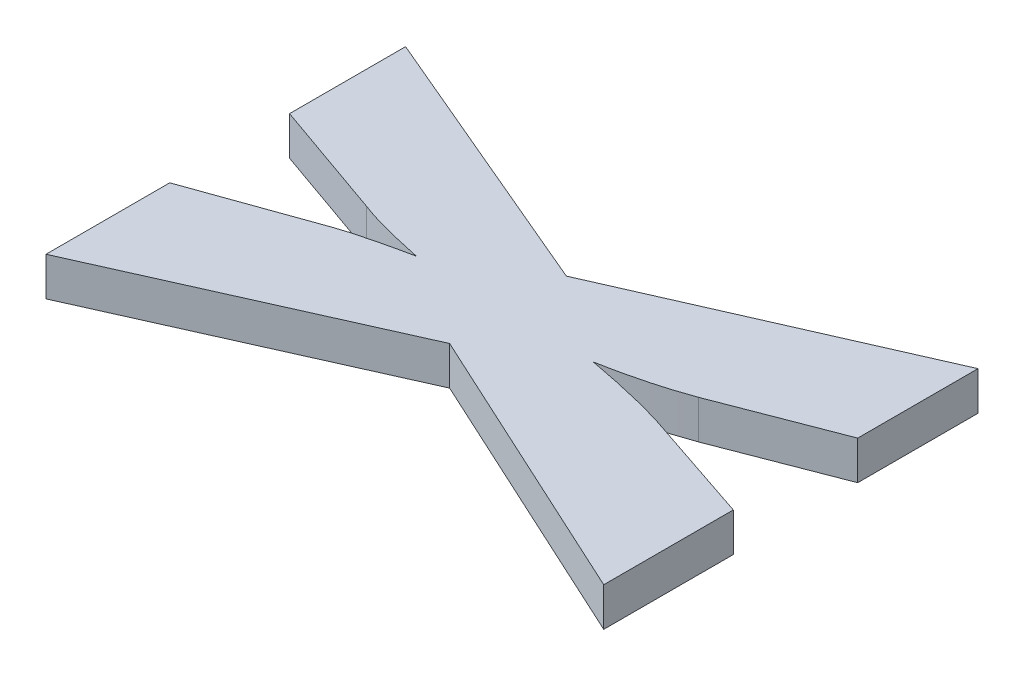
ISO-10303-21;
HEADER;
FILE_DESCRIPTION(('STEP AP214'),'2;1');
FILE_NAME('part.step','',(''),(''),'','','');
FILE_SCHEMA(('AUTOMOTIVE_DESIGN { 1 0 10303 214 1 1 1 1 }'));
ENDSEC;
DATA;
#1=APPLICATION_CONTEXT('core data for automotive mechanical design processes');
#2=APPLICATION_PROTOCOL_DEFINITION('international standard','automotive_design',2000,#1);
#3=PRODUCT_CONTEXT('',#1,'mechanical');
#4=PRODUCT('Part','Part','',(#3));
#5=PRODUCT_RELATED_PRODUCT_CATEGORY('part','',(#4));
#6=PRODUCT_DEFINITION_FORMATION('','',#4);
#7=PRODUCT_DEFINITION_CONTEXT('part definition',#1,'design');
#8=PRODUCT_DEFINITION('design','',#6,#7);
#9=PRODUCT_DEFINITION_SHAPE('','',#8);
#10=(LENGTH_UNIT() NAMED_UNIT(*) SI_UNIT(.MILLI.,.METRE.));
#11=(NAMED_UNIT(*) PLANE_ANGLE_UNIT() SI_UNIT($,.RADIAN.));
#12=(NAMED_UNIT(*) SI_UNIT($,.STERADIAN.) SOLID_ANGLE_UNIT());
#13=UNCERTAINTY_MEASURE_WITH_UNIT(LENGTH_MEASURE(1.E-05),#10,'distance_accuracy_value','');
#14=(GEOMETRIC_REPRESENTATION_CONTEXT(3) GLOBAL_UNCERTAINTY_ASSIGNED_CONTEXT((#13)) GLOBAL_UNIT_ASSIGNED_CONTEXT((#10,
#11,#12)) REPRESENTATION_CONTEXT('',''));
#15=CARTESIAN_POINT('',(0.,0.,0.));
#16=DIRECTION('',(0.,0.,1.));
#17=DIRECTION('',(1.,0.,0.));
#18=AXIS2_PLACEMENT_3D('',#15,#16,#17);
#19=CARTESIAN_POINT('',(2.55,2.9956,3.4607792207792));
#20=DIRECTION('',(1.,0.,0.));
#21=DIRECTION('',(0.,-1.,0.));
#22=AXIS2_PLACEMENT_3D('',#19,#20,#21);
#23=PLANE('',#22);
#24=DIRECTION('',(0.,0.,1.));
#25=VECTOR('',#24,1.);
#26=CARTESIAN_POINT('',(2.55,2.9306,3.4607792207792));
#27=LINE('',#26,#25);
#28=CARTESIAN_POINT('',(2.55,2.9306,3.4607792207792));
#29=VERTEX_POINT('',#28);
#30=CARTESIAN_POINT('',(2.55,2.9306,3.6630012175325));
#31=VERTEX_POINT('',#30);
#32=EDGE_CURVE('E11',#29,#31,#27,.T.);
#33=ORIENTED_EDGE('',*,*,#32,.F.);
#34=DIRECTION('',(0.,-1.,0.));
#35=VECTOR('',#34,1.);
#36=CARTESIAN_POINT('',(2.55,2.9956,3.4607792207792));
#37=LINE('',#36,#35);
#38=CARTESIAN_POINT('',(2.55,2.9956,3.4607792207792));
#39=VERTEX_POINT('',#38);
#40=EDGE_CURVE('E24',#39,#29,#37,.T.);
#41=ORIENTED_EDGE('',*,*,#40,.F.);
#42=DIRECTION('',(0.,0.,1.));
#43=VECTOR('',#42,1.);
#44=CARTESIAN_POINT('',(2.55,2.9956,3.4607792207792));
#45=LINE('',#44,#43);
#46=CARTESIAN_POINT('',(2.55,2.9956,3.6630012175325));
#47=VERTEX_POINT('',#46);
#48=EDGE_CURVE('E309',#39,#47,#45,.T.);
#49=ORIENTED_EDGE('',*,*,#48,.T.);
#50=DIRECTION('',(0.,-1.,0.));
#51=VECTOR('',#50,1.);
#52=CARTESIAN_POINT('',(2.55,2.9956,3.6630012175325));
#53=LINE('',#52,#51);
#54=EDGE_CURVE('E150',#47,#31,#53,.T.);
#55=ORIENTED_EDGE('',*,*,#54,.T.);
#56=EDGE_LOOP('',(#33,#41,#49,#55));
#57=FACE_BOUND('',#56,.T.);
#58=ADVANCED_FACE('F17',(#57),#23,.T.);
#59=CARTESIAN_POINT('',(2.0692167207792,2.9956,3.6720616883117));
#60=DIRECTION('',(-0.402320316865227,0.,-0.91549896921704));
#61=DIRECTION('',(-0.91549896921704,0.,0.402320316865227));
#62=AXIS2_PLACEMENT_3D('',#59,#60,#61);
#63=PLANE('',#62);
#64=DIRECTION('',(0.91549896921704,0.,-0.402320316865228));
#65=VECTOR('',#64,1.);
#66=CARTESIAN_POINT('',(2.0692167207792,2.9306,3.6720616883117));
#67=LINE('',#66,#65);
#68=CARTESIAN_POINT('',(2.0692167207792,2.9306,3.6720616883117));
#69=VERTEX_POINT('',#68);
#70=EDGE_CURVE('E306',#69,#29,#67,.T.);
#71=ORIENTED_EDGE('',*,*,#70,.F.);
#72=DIRECTION('',(0.,-1.,0.));
#73=VECTOR('',#72,1.);
#74=CARTESIAN_POINT('',(2.0692167207792,2.9956,3.6720616883117));
#75=LINE('',#74,#73);
#76=CARTESIAN_POINT('',(2.0692167207792,2.9956,3.6720616883117));
#77=VERTEX_POINT('',#76);
#78=EDGE_CURVE('E303',#77,#69,#75,.T.);
#79=ORIENTED_EDGE('',*,*,#78,.F.);
#80=DIRECTION('',(0.91549896921704,0.,-0.402320316865228));
#81=VECTOR('',#80,1.);
#82=CARTESIAN_POINT('',(2.0692167207792,2.9956,3.6720616883117));
#83=LINE('',#82,#81);
#84=EDGE_CURVE('E300',#77,#39,#83,.T.);
#85=ORIENTED_EDGE('',*,*,#84,.T.);
#86=ORIENTED_EDGE('',*,*,#40,.T.);
#87=EDGE_LOOP('',(#71,#79,#85,#86));
#88=FACE_BOUND('',#87,.T.);
#89=ADVANCED_FACE('F311',(#88),#63,.T.);
#90=CARTESIAN_POINT('',(1.6,2.9956,3.4731168831169));
#91=DIRECTION('',(0.390355561117717,0.,-0.920664181938492));
#92=DIRECTION('',(-0.920664181938492,0.,-0.390355561117717));
#93=AXIS2_PLACEMENT_3D('',#90,#91,#92);
#94=PLANE('',#93);
#95=DIRECTION('',(0.920664181938492,0.,0.390355561117717));
#96=VECTOR('',#95,1.);
#97=CARTESIAN_POINT('',(1.6,2.9306,3.4731168831169));
#98=LINE('',#97,#96);
#99=CARTESIAN_POINT('',(1.6,2.9306,3.4731168831169));
#100=VERTEX_POINT('',#99);
#101=EDGE_CURVE('E297',#100,#69,#98,.T.);
#102=ORIENTED_EDGE('',*,*,#101,.F.);
#103=DIRECTION('',(0.,-1.,0.));
#104=VECTOR('',#103,1.);
#105=CARTESIAN_POINT('',(1.6,2.9956,3.4731168831169));
#106=LINE('',#105,#104);
#107=CARTESIAN_POINT('',(1.6,2.9956,3.4731168831169));
#108=VERTEX_POINT('',#107);
#109=EDGE_CURVE('E294',#108,#100,#106,.T.);
#110=ORIENTED_EDGE('',*,*,#109,.F.);
#111=DIRECTION('',(0.920664181938492,0.,0.390355561117717));
#112=VECTOR('',#111,1.);
#113=CARTESIAN_POINT('',(1.6,2.9956,3.4731168831169));
#114=LINE('',#113,#112);
#115=EDGE_CURVE('E291',#108,#77,#114,.T.);
#116=ORIENTED_EDGE('',*,*,#115,.T.);
#117=ORIENTED_EDGE('',*,*,#78,.T.);
#118=EDGE_LOOP('',(#102,#110,#116,#117));
#119=FACE_BOUND('',#118,.T.);
#120=ADVANCED_FACE('F315',(#119),#94,.T.);
#121=CARTESIAN_POINT('',(1.6,2.9956,3.6682061688312));
#122=DIRECTION('',(-1.,0.,0.));
#123=DIRECTION('',(0.,1.,0.));
#124=AXIS2_PLACEMENT_3D('',#121,#122,#123);
#125=PLANE('',#124);
#126=DIRECTION('',(0.,0.,-1.));
#127=VECTOR('',#126,1.);
#128=CARTESIAN_POINT('',(1.6,2.9306,3.6682061688312));
#129=LINE('',#128,#127);
#130=CARTESIAN_POINT('',(1.6,2.9306,3.6682061688312));
#131=VERTEX_POINT('',#130);
#132=EDGE_CURVE('E288',#131,#100,#129,.T.);
#133=ORIENTED_EDGE('',*,*,#132,.F.);
#134=DIRECTION('',(0.,-1.,0.));
#135=VECTOR('',#134,1.);
#136=CARTESIAN_POINT('',(1.6,2.9956,3.6682061688312));
#137=LINE('',#136,#135);
#138=CARTESIAN_POINT('',(1.6,2.9956,3.6682061688312));
#139=VERTEX_POINT('',#138);
#140=EDGE_CURVE('E285',#139,#131,#137,.T.);
#141=ORIENTED_EDGE('',*,*,#140,.F.);
#142=DIRECTION('',(0.,0.,-1.));
#143=VECTOR('',#142,1.);
#144=CARTESIAN_POINT('',(1.6,2.9956,3.6682061688312));
#145=LINE('',#144,#143);
#146=EDGE_CURVE('E282',#139,#108,#145,.T.);
#147=ORIENTED_EDGE('',*,*,#146,.T.);
#148=ORIENTED_EDGE('',*,*,#109,.T.);
#149=EDGE_LOOP('',(#133,#141,#147,#148));
#150=FACE_BOUND('',#149,.T.);
#151=ADVANCED_FACE('F318',(#150),#125,.T.);
#152=CARTESIAN_POINT('',(1.7991375811688,2.9956,3.7381838474026));
#153=DIRECTION('',(-0.331529937835981,0.,0.943444699131046));
#154=DIRECTION('',(0.943444699131046,0.,0.331529937835981));
#155=AXIS2_PLACEMENT_3D('',#152,#153,#154);
#156=PLANE('',#155);
#157=DIRECTION('',(-0.943444699131046,0.,-0.331529937835981));
#158=VECTOR('',#157,1.);
#159=CARTESIAN_POINT('',(1.7991375811688,2.9306,3.7381838474026));
#160=LINE('',#159,#158);
#161=CARTESIAN_POINT('',(1.7991375811688,2.9306,3.7381838474026));
#162=VERTEX_POINT('',#161);
#163=EDGE_CURVE('E279',#162,#131,#160,.T.);
#164=ORIENTED_EDGE('',*,*,#163,.F.);
#165=DIRECTION('',(0.,-1.,0.));
#166=VECTOR('',#165,1.);
#167=CARTESIAN_POINT('',(1.7991375811688,2.9956,3.7381838474026));
#168=LINE('',#167,#166);
#169=CARTESIAN_POINT('',(1.7991375811688,2.9956,3.7381838474026));
#170=VERTEX_POINT('',#169);
#171=EDGE_CURVE('E276',#170,#162,#168,.T.);
#172=ORIENTED_EDGE('',*,*,#171,.F.);
#173=DIRECTION('',(-0.943444699131046,0.,-0.331529937835981));
#174=VECTOR('',#173,1.);
#175=CARTESIAN_POINT('',(1.7991375811688,2.9956,3.7381838474026));
#176=LINE('',#175,#174);
#177=EDGE_CURVE('E270',#170,#139,#176,.T.);
#178=ORIENTED_EDGE('',*,*,#177,.T.);
#179=ORIENTED_EDGE('',*,*,#140,.T.);
#180=EDGE_LOOP('',(#164,#172,#178,#179));
#181=FACE_BOUND('',#180,.T.);
#182=ADVANCED_FACE('F323',(#181),#156,.T.);
#183=CARTESIAN_POINT('',(1.9142248376623,2.9956,3.7692207792208));
#184=CARTESIAN_POINT('',(1.9142248376623,2.9306,3.7692207792208));
#185=CARTESIAN_POINT('',(1.9025171784066,2.9956,3.7667062151642));
#186=CARTESIAN_POINT('',(1.9025171784066,2.9306,3.7667062151642));
#187=CARTESIAN_POINT('',(1.880325663978,2.9956,3.7619399349605));
#188=CARTESIAN_POINT('',(1.880325663978,2.9306,3.7619399349605));
#189=CARTESIAN_POINT('',(1.849220311507,2.9956,3.7543701297181));
#190=CARTESIAN_POINT('',(1.849220311507,2.9306,3.7543701297181));
#191=CARTESIAN_POINT('',(1.8224970983693,2.9956,3.7466435022342));
#192=CARTESIAN_POINT('',(1.8224970983693,2.9306,3.7466435022342));
#193=CARTESIAN_POINT('',(1.8064384882112,2.9956,3.7408278726624));
#194=CARTESIAN_POINT('',(1.8064384882112,2.9306,3.7408278726624));
#195=CARTESIAN_POINT('',(1.7991375811688,2.9956,3.7381838474026));
#196=CARTESIAN_POINT('',(1.7991375811688,2.9306,3.7381838474026));
#197=B_SPLINE_SURFACE_WITH_KNOTS('',3,1,((#183,#184),(#185,#186),(#187,#188),(#189,#190),(#191,
#192),(#193,#194),(#195,#196)),.UNSPECIFIED.,.F.,.F.,.F.,(4,1,1,1,4),(2,2),(0.,0.3010674656506,
0.570664285833863,0.804806262295986,1.),(0.,1.),.UNSPECIFIED.);
#198=CARTESIAN_POINT('',(1.9142248376623,2.9306,3.7692207792208));
#199=CARTESIAN_POINT('',(1.9025171784066,2.9306,3.7667062151642));
#200=CARTESIAN_POINT('',(1.880325663978,2.9306,3.7619399349605));
#201=CARTESIAN_POINT('',(1.849220311507,2.9306,3.7543701297181));
#202=CARTESIAN_POINT('',(1.8224970983693,2.9306,3.7466435022342));
#203=CARTESIAN_POINT('',(1.8064384882112,2.9306,3.7408278726624));
#204=CARTESIAN_POINT('',(1.7991375811688,2.9306,3.7381838474026));
#205=B_SPLINE_CURVE_WITH_KNOTS('',3,(#198,#199,#200,#201,#202,#203,#204),.UNSPECIFIED.,.F.,.F.,
(4,1,1,1,4),(0.,0.3010674656506,0.570664285833863,0.804806262295986,1.),.UNSPECIFIED.);
#206=CARTESIAN_POINT('',(1.9142248376623,2.9306,3.7692207792208));
#207=VERTEX_POINT('',#206);
#208=EDGE_CURVE('E265',#207,#162,#205,.T.);
#209=DIRECTION('',(0.,-1.,0.));
#210=VECTOR('',#209,1.);
#211=CARTESIAN_POINT('',(1.9142248376623,2.9956,3.7692207792208));
#212=LINE('',#211,#210);
#213=CARTESIAN_POINT('',(1.9142248376623,2.9956,3.7692207792208));
#214=VERTEX_POINT('',#213);
#215=EDGE_CURVE('E259',#214,#207,#212,.T.);
#216=CARTESIAN_POINT('',(1.9142248376623,2.9956,3.7692207792208));
#217=CARTESIAN_POINT('',(1.9025171784066,2.9956,3.7667062151642));
#218=CARTESIAN_POINT('',(1.880325663978,2.9956,3.7619399349605));
#219=CARTESIAN_POINT('',(1.849220311507,2.9956,3.7543701297181));
#220=CARTESIAN_POINT('',(1.8224970983693,2.9956,3.7466435022342));
#221=CARTESIAN_POINT('',(1.8064384882112,2.9956,3.7408278726624));
#222=CARTESIAN_POINT('',(1.7991375811688,2.9956,3.7381838474026));
#223=B_SPLINE_CURVE_WITH_KNOTS('',3,(#216,#217,#218,#219,#220,#221,#222),.UNSPECIFIED.,.F.,.F.,
(4,1,1,1,4),(0.,0.3010674656506,0.570664285833863,0.804806262295986,1.),.UNSPECIFIED.);
#224=EDGE_CURVE('E251',#214,#170,#223,.T.);
#225=ORIENTED_EDGE('',*,*,#208,.F.);
#226=ORIENTED_EDGE('',*,*,#215,.F.);
#227=ORIENTED_EDGE('',*,*,#224,.T.);
#228=ORIENTED_EDGE('',*,*,#171,.T.);
#229=EDGE_LOOP('',(#225,#226,#227,#228));
#230=FACE_BOUND('',#229,.T.);
#231=ADVANCED_FACE('F325',(#230),#197,.T.);
#232=CARTESIAN_POINT('',(1.7997159090909,2.9956,3.7983299512987));
#233=CARTESIAN_POINT('',(1.7997159090909,2.9306,3.7983299512987));
#234=CARTESIAN_POINT('',(1.8060603220322,2.9956,3.7962177128918));
#235=CARTESIAN_POINT('',(1.8060603220322,2.9306,3.7962177128918));
#236=CARTESIAN_POINT('',(1.8204377260843,2.9956,3.7914310596096));
#237=CARTESIAN_POINT('',(1.8204377260843,2.9306,3.7914310596096));
#238=CARTESIAN_POINT('',(1.839945048113,2.9956,3.7862026222159));
#239=CARTESIAN_POINT('',(1.839945048113,2.9306,3.7862026222159));
#240=CARTESIAN_POINT('',(1.8586298130678,2.9956,3.7815792860341));
#241=CARTESIAN_POINT('',(1.8586298130678,2.9306,3.7815792860341));
#242=CARTESIAN_POINT('',(1.875291801889,2.9956,3.7774551702995));
#243=CARTESIAN_POINT('',(1.875291801889,2.9306,3.7774551702995));
#244=CARTESIAN_POINT('',(1.8941112192192,2.9956,3.7735210236374));
#245=CARTESIAN_POINT('',(1.8941112192192,2.9306,3.7735210236374));
#246=CARTESIAN_POINT('',(1.9072862348531,2.9956,3.7707042362165));
#247=CARTESIAN_POINT('',(1.9072862348531,2.9306,3.7707042362165));
#248=CARTESIAN_POINT('',(1.9142248376623,2.9956,3.7692207792208));
#249=CARTESIAN_POINT('',(1.9142248376623,2.9306,3.7692207792208));
#250=B_SPLINE_SURFACE_WITH_KNOTS('',3,1,((#232,#233),(#234,#235),(#236,#237),(#238,#239),(#240,
#241),(#242,#243),(#244,#245),(#246,#247),(#248,#249)),.UNSPECIFIED.,.F.,.F.,.F.,(4,1,1,1,1,1,
4),(2,2),(0.,0.169649247705459,0.384450981349389,0.512187785775841,0.658121032133517,
0.819949939128924,1.),(0.,1.),.UNSPECIFIED.);
#251=CARTESIAN_POINT('',(1.7997159090909,2.9306,3.7983299512987));
#252=CARTESIAN_POINT('',(1.8060603220322,2.9306,3.7962177128918));
#253=CARTESIAN_POINT('',(1.8204377260843,2.9306,3.7914310596096));
#254=CARTESIAN_POINT('',(1.839945048113,2.9306,3.7862026222159));
#255=CARTESIAN_POINT('',(1.8586298130678,2.9306,3.7815792860341));
#256=CARTESIAN_POINT('',(1.875291801889,2.9306,3.7774551702995));
#257=CARTESIAN_POINT('',(1.8941112192192,2.9306,3.7735210236374));
#258=CARTESIAN_POINT('',(1.9072862348531,2.9306,3.7707042362165));
#259=CARTESIAN_POINT('',(1.9142248376623,2.9306,3.7692207792208));
#260=B_SPLINE_CURVE_WITH_KNOTS('',3,(#251,#252,#253,#254,#255,#256,#257,#258,#259),
.UNSPECIFIED.,.F.,.F.,(4,1,1,1,1,1,4),(0.,0.169649247705459,0.384450981349389,0.512187785775841,
0.658121032133517,0.819949939128924,1.),.UNSPECIFIED.);
#261=CARTESIAN_POINT('',(1.7997159090909,2.9306,3.7983299512987));
#262=VERTEX_POINT('',#261);
#263=EDGE_CURVE('E246',#262,#207,#260,.T.);
#264=DIRECTION('',(0.,-1.,0.));
#265=VECTOR('',#264,1.);
#266=CARTESIAN_POINT('',(1.7997159090909,2.9956,3.7983299512987));
#267=LINE('',#266,#265);
#268=CARTESIAN_POINT('',(1.7997159090909,2.9956,3.7983299512987));
#269=VERTEX_POINT('',#268);
#270=EDGE_CURVE('E240',#269,#262,#267,.T.);
#271=CARTESIAN_POINT('',(1.7997159090909,2.9956,3.7983299512987));
#272=CARTESIAN_POINT('',(1.8060603220322,2.9956,3.7962177128918));
#273=CARTESIAN_POINT('',(1.8204377260843,2.9956,3.7914310596096));
#274=CARTESIAN_POINT('',(1.839945048113,2.9956,3.7862026222159));
#275=CARTESIAN_POINT('',(1.8586298130678,2.9956,3.7815792860341));
#276=CARTESIAN_POINT('',(1.875291801889,2.9956,3.7774551702995));
#277=CARTESIAN_POINT('',(1.8941112192192,2.9956,3.7735210236374));
#278=CARTESIAN_POINT('',(1.9072862348531,2.9956,3.7707042362165));
#279=CARTESIAN_POINT('',(1.9142248376623,2.9956,3.7692207792208));
#280=B_SPLINE_CURVE_WITH_KNOTS('',3,(#271,#272,#273,#274,#275,#276,#277,#278,#279),
.UNSPECIFIED.,.F.,.F.,(4,1,1,1,1,1,4),(0.,0.169649247705459,0.384450981349389,0.512187785775841,
0.658121032133517,0.819949939128924,1.),.UNSPECIFIED.);
#281=EDGE_CURVE('E235',#269,#214,#280,.T.);
#282=ORIENTED_EDGE('',*,*,#263,.F.);
#283=ORIENTED_EDGE('',*,*,#270,.F.);
#284=ORIENTED_EDGE('',*,*,#281,.T.);
#285=ORIENTED_EDGE('',*,*,#215,.T.);
#286=EDGE_LOOP('',(#282,#283,#284,#285));
#287=FACE_BOUND('',#286,.T.);
#288=ADVANCED_FACE('F327',(#287),#250,.T.);
#289=CARTESIAN_POINT('',(1.6,2.9956,3.8696570616883));
#290=DIRECTION('',(-0.336336396998157,0.,-0.941741911594837));
#291=DIRECTION('',(-0.941741911594837,0.,0.336336396998157));
#292=AXIS2_PLACEMENT_3D('',#289,#290,#291);
#293=PLANE('',#292);
#294=DIRECTION('',(0.941741911594837,0.,-0.336336396998157));
#295=VECTOR('',#294,1.);
#296=CARTESIAN_POINT('',(1.6,2.9306,3.8696570616883));
#297=LINE('',#296,#295);
#298=CARTESIAN_POINT('',(1.6,2.9306,3.8696570616883));
#299=VERTEX_POINT('',#298);
#300=EDGE_CURVE('E232',#299,#262,#297,.T.);
#301=ORIENTED_EDGE('',*,*,#300,.F.);
#302=DIRECTION('',(0.,-1.,0.));
#303=VECTOR('',#302,1.);
#304=CARTESIAN_POINT('',(1.6,2.9956,3.8696570616883));
#305=LINE('',#304,#303);
#306=CARTESIAN_POINT('',(1.6,2.9956,3.8696570616883));
#307=VERTEX_POINT('',#306);
#308=EDGE_CURVE('E229',#307,#299,#305,.T.);
#309=ORIENTED_EDGE('',*,*,#308,.F.);
#310=DIRECTION('',(0.941741911594837,0.,-0.336336396998157));
#311=VECTOR('',#310,1.);
#312=CARTESIAN_POINT('',(1.6,2.9956,3.8696570616883));
#313=LINE('',#312,#311);
#314=EDGE_CURVE('E226',#307,#269,#313,.T.);
#315=ORIENTED_EDGE('',*,*,#314,.T.);
#316=ORIENTED_EDGE('',*,*,#270,.T.);
#317=EDGE_LOOP('',(#301,#309,#315,#316));
#318=FACE_BOUND('',#317,.T.);
#319=ADVANCED_FACE('F330',(#318),#293,.T.);
#320=CARTESIAN_POINT('',(1.6,2.9956,4.0776623376623));
#321=DIRECTION('',(-1.,0.,0.));
#322=DIRECTION('',(0.,1.,0.));
#323=AXIS2_PLACEMENT_3D('',#320,#321,#322);
#324=PLANE('',#323);
#325=DIRECTION('',(0.,0.,-1.));
#326=VECTOR('',#325,1.);
#327=CARTESIAN_POINT('',(1.6,2.9306,4.0776623376623));
#328=LINE('',#327,#326);
#329=CARTESIAN_POINT('',(1.6,2.9306,4.0776623376623));
#330=VERTEX_POINT('',#329);
#331=EDGE_CURVE('E223',#330,#299,#328,.T.);
#332=ORIENTED_EDGE('',*,*,#331,.F.);
#333=DIRECTION('',(0.,-1.,0.));
#334=VECTOR('',#333,1.);
#335=CARTESIAN_POINT('',(1.6,2.9956,4.0776623376623));
#336=LINE('',#335,#334);
#337=CARTESIAN_POINT('',(1.6,2.9956,4.0776623376623));
#338=VERTEX_POINT('',#337);
#339=EDGE_CURVE('E220',#338,#330,#336,.T.);
#340=ORIENTED_EDGE('',*,*,#339,.F.);
#341=DIRECTION('',(0.,0.,-1.));
#342=VECTOR('',#341,1.);
#343=CARTESIAN_POINT('',(1.6,2.9956,4.0776623376623));
#344=LINE('',#343,#342);
#345=EDGE_CURVE('E217',#338,#307,#344,.T.);
#346=ORIENTED_EDGE('',*,*,#345,.T.);
#347=ORIENTED_EDGE('',*,*,#308,.T.);
#348=EDGE_LOOP('',(#332,#340,#346,#347));
#349=FACE_BOUND('',#348,.T.);
#350=ADVANCED_FACE('F335',(#349),#324,.T.);
#351=CARTESIAN_POINT('',(2.0692167207792,2.9956,3.8683076298701));
#352=DIRECTION('',(0.407460890119683,0.,0.913222657966214));
#353=DIRECTION('',(0.913222657966214,0.,-0.407460890119683));
#354=AXIS2_PLACEMENT_3D('',#351,#352,#353);
#355=PLANE('',#354);
#356=DIRECTION('',(-0.913222657966213,0.,0.407460890119683));
#357=VECTOR('',#356,1.);
#358=CARTESIAN_POINT('',(2.0692167207792,2.9306,3.8683076298701));
#359=LINE('',#358,#357);
#360=CARTESIAN_POINT('',(2.0692167207792,2.9306,3.8683076298701));
#361=VERTEX_POINT('',#360);
#362=EDGE_CURVE('E214',#361,#330,#359,.T.);
#363=ORIENTED_EDGE('',*,*,#362,.F.);
#364=DIRECTION('',(0.,-1.,0.));
#365=VECTOR('',#364,1.);
#366=CARTESIAN_POINT('',(2.0692167207792,2.9956,3.8683076298701));
#367=LINE('',#366,#365);
#368=CARTESIAN_POINT('',(2.0692167207792,2.9956,3.8683076298701));
#369=VERTEX_POINT('',#368);
#370=EDGE_CURVE('E211',#369,#361,#367,.T.);
#371=ORIENTED_EDGE('',*,*,#370,.F.);
#372=DIRECTION('',(-0.913222657966213,0.,0.407460890119683));
#373=VECTOR('',#372,1.);
#374=CARTESIAN_POINT('',(2.0692167207792,2.9956,3.8683076298701));
#375=LINE('',#374,#373);
#376=EDGE_CURVE('E208',#369,#338,#375,.T.);
#377=ORIENTED_EDGE('',*,*,#376,.T.);
#378=ORIENTED_EDGE('',*,*,#339,.T.);
#379=EDGE_LOOP('',(#363,#371,#377,#378));
#380=FACE_BOUND('',#379,.T.);
#381=ADVANCED_FACE('F337',(#380),#355,.T.);
#382=CARTESIAN_POINT('',(2.55,2.9956,4.09));
#383=DIRECTION('',(-0.418734885793666,0.,0.908108526234263));
#384=DIRECTION('',(0.908108526234263,0.,0.418734885793666));
#385=AXIS2_PLACEMENT_3D('',#382,#383,#384);
#386=PLANE('',#385);
#387=DIRECTION('',(-0.908108526234263,0.,-0.418734885793666));
#388=VECTOR('',#387,1.);
#389=CARTESIAN_POINT('',(2.55,2.9306,4.09));
#390=LINE('',#389,#388);
#391=CARTESIAN_POINT('',(2.55,2.9306,4.09));
#392=VERTEX_POINT('',#391);
#393=EDGE_CURVE('E205',#392,#361,#390,.T.);
#394=ORIENTED_EDGE('',*,*,#393,.F.);
#395=DIRECTION('',(0.,-1.,0.));
#396=VECTOR('',#395,1.);
#397=CARTESIAN_POINT('',(2.55,2.9956,4.09));
#398=LINE('',#397,#396);
#399=CARTESIAN_POINT('',(2.55,2.9956,4.09));
#400=VERTEX_POINT('',#399);
#401=EDGE_CURVE('E202',#400,#392,#398,.T.);
#402=ORIENTED_EDGE('',*,*,#401,.F.);
#403=DIRECTION('',(-0.908108526234263,0.,-0.418734885793666));
#404=VECTOR('',#403,1.);
#405=CARTESIAN_POINT('',(2.55,2.9956,4.09));
#406=LINE('',#405,#404);
#407=EDGE_CURVE('E199',#400,#369,#406,.T.);
#408=ORIENTED_EDGE('',*,*,#407,.T.);
#409=ORIENTED_EDGE('',*,*,#370,.T.);
#410=EDGE_LOOP('',(#394,#402,#408,#409));
#411=FACE_BOUND('',#410,.T.);
#412=ADVANCED_FACE('F339',(#411),#386,.T.);
#413=CARTESIAN_POINT('',(2.55,2.9956,3.8721631493506));
#414=DIRECTION('',(1.,0.,0.));
#415=DIRECTION('',(0.,-1.,0.));
#416=AXIS2_PLACEMENT_3D('',#413,#414,#415);
#417=PLANE('',#416);
#418=DIRECTION('',(0.,0.,1.));
#419=VECTOR('',#418,1.);
#420=CARTESIAN_POINT('',(2.55,2.9306,3.8721631493506));
#421=LINE('',#420,#419);
#422=CARTESIAN_POINT('',(2.55,2.9306,3.8721631493506));
#423=VERTEX_POINT('',#422);
#424=EDGE_CURVE('E196',#423,#392,#421,.T.);
#425=ORIENTED_EDGE('',*,*,#424,.F.);
#426=DIRECTION('',(0.,-1.,0.));
#427=VECTOR('',#426,1.);
#428=CARTESIAN_POINT('',(2.55,2.9956,3.8721631493506));
#429=LINE('',#428,#427);
#430=CARTESIAN_POINT('',(2.55,2.9956,3.8721631493506));
#431=VERTEX_POINT('',#430);
#432=EDGE_CURVE('E193',#431,#423,#429,.T.);
#433=ORIENTED_EDGE('',*,*,#432,.F.);
#434=DIRECTION('',(0.,0.,1.));
#435=VECTOR('',#434,1.);
#436=CARTESIAN_POINT('',(2.55,2.9956,3.8721631493506));
#437=LINE('',#436,#435);
#438=EDGE_CURVE('E190',#431,#400,#437,.T.);
#439=ORIENTED_EDGE('',*,*,#438,.T.);
#440=ORIENTED_EDGE('',*,*,#401,.T.);
#441=EDGE_LOOP('',(#425,#433,#439,#440));
#442=FACE_BOUND('',#441,.T.);
#443=ADVANCED_FACE('F342',(#442),#417,.T.);
#444=CARTESIAN_POINT('',(2.356838474026,2.9956,3.8073904220779));
#445=DIRECTION('',(0.317930455250051,0.,-0.948114036192111));
#446=DIRECTION('',(-0.948114036192111,0.,-0.317930455250051));
#447=AXIS2_PLACEMENT_3D('',#444,#445,#446);
#448=PLANE('',#447);
#449=DIRECTION('',(0.948114036192111,0.,0.317930455250051));
#450=VECTOR('',#449,1.);
#451=CARTESIAN_POINT('',(2.356838474026,2.9306,3.8073904220779));
#452=LINE('',#451,#450);
#453=CARTESIAN_POINT('',(2.356838474026,2.9306,3.8073904220779));
#454=VERTEX_POINT('',#453);
#455=EDGE_CURVE('E187',#454,#423,#452,.T.);
#456=ORIENTED_EDGE('',*,*,#455,.F.);
#457=DIRECTION('',(0.,-1.,0.));
#458=VECTOR('',#457,1.);
#459=CARTESIAN_POINT('',(2.356838474026,2.9956,3.8073904220779));
#460=LINE('',#459,#458);
#461=CARTESIAN_POINT('',(2.356838474026,2.9956,3.8073904220779));
#462=VERTEX_POINT('',#461);
#463=EDGE_CURVE('E184',#462,#454,#460,.T.);
#464=ORIENTED_EDGE('',*,*,#463,.F.);
#465=DIRECTION('',(0.948114036192111,0.,0.317930455250051));
#466=VECTOR('',#465,1.);
#467=CARTESIAN_POINT('',(2.356838474026,2.9956,3.8073904220779));
#468=LINE('',#467,#466);
#469=EDGE_CURVE('E178',#462,#431,#468,.T.);
#470=ORIENTED_EDGE('',*,*,#469,.T.);
#471=ORIENTED_EDGE('',*,*,#432,.T.);
#472=EDGE_LOOP('',(#456,#464,#470,#471));
#473=FACE_BOUND('',#472,.T.);
#474=ADVANCED_FACE('F345',(#473),#448,.T.);
#475=CARTESIAN_POINT('',(2.2168831168831,2.9956,3.7744257305195));
#476=CARTESIAN_POINT('',(2.2168831168831,2.9306,3.7744257305195));
#477=CARTESIAN_POINT('',(2.2298153814939,2.9956,3.7768527302056));
#478=CARTESIAN_POINT('',(2.2298153814939,2.9306,3.7768527302056));
#479=CARTESIAN_POINT('',(2.25497640389,2.9956,3.7815747023655));
#480=CARTESIAN_POINT('',(2.25497640389,2.9306,3.7815747023655));
#481=CARTESIAN_POINT('',(2.2913270256594,2.9956,3.7897542542711));
#482=CARTESIAN_POINT('',(2.2913270256594,2.9306,3.7897542542711));
#483=CARTESIAN_POINT('',(2.3251385844907,2.9956,3.7980131535678));
#484=CARTESIAN_POINT('',(2.3251385844907,2.9306,3.7980131535678));
#485=CARTESIAN_POINT('',(2.3465786549054,2.9956,3.8043554247903));
#486=CARTESIAN_POINT('',(2.3465786549054,2.9306,3.8043554247903));
#487=CARTESIAN_POINT('',(2.356838474026,2.9956,3.8073904220779));
#488=CARTESIAN_POINT('',(2.356838474026,2.9306,3.8073904220779));
#489=B_SPLINE_SURFACE_WITH_KNOTS('',3,1,((#475,#476),(#477,#478),(#479,#480),(#481,#482),(#483,
#484),(#485,#486),(#487,#488)),.UNSPECIFIED.,.F.,.F.,.F.,(4,1,1,1,4),(2,2),(0.,
0.274367467869153,0.533809523050541,0.776911648295732,1.),(0.,1.),.UNSPECIFIED.);
#490=CARTESIAN_POINT('',(2.2168831168831,2.9306,3.7744257305195));
#491=CARTESIAN_POINT('',(2.2298153814939,2.9306,3.7768527302056));
#492=CARTESIAN_POINT('',(2.25497640389,2.9306,3.7815747023655));
#493=CARTESIAN_POINT('',(2.2913270256594,2.9306,3.7897542542711));
#494=CARTESIAN_POINT('',(2.3251385844907,2.9306,3.7980131535678));
#495=CARTESIAN_POINT('',(2.3465786549054,2.9306,3.8043554247903));
#496=CARTESIAN_POINT('',(2.356838474026,2.9306,3.8073904220779));
#497=B_SPLINE_CURVE_WITH_KNOTS('',3,(#490,#491,#492,#493,#494,#495,#496),.UNSPECIFIED.,.F.,.F.,
(4,1,1,1,4),(0.,0.274367467869153,0.533809523050541,0.776911648295732,1.),.UNSPECIFIED.);
#498=CARTESIAN_POINT('',(2.2168831168831,2.9306,3.7744257305195));
#499=VERTEX_POINT('',#498);
#500=EDGE_CURVE('E173',#499,#454,#497,.T.);
#501=DIRECTION('',(0.,-1.,0.));
#502=VECTOR('',#501,1.);
#503=CARTESIAN_POINT('',(2.2168831168831,2.9956,3.7744257305195));
#504=LINE('',#503,#502);
#505=CARTESIAN_POINT('',(2.2168831168831,2.9956,3.7744257305195));
#506=VERTEX_POINT('',#505);
#507=EDGE_CURVE('E168',#506,#499,#504,.T.);
#508=CARTESIAN_POINT('',(2.2168831168831,2.9956,3.7744257305195));
#509=CARTESIAN_POINT('',(2.2298153814939,2.9956,3.7768527302056));
#510=CARTESIAN_POINT('',(2.25497640389,2.9956,3.7815747023655));
#511=CARTESIAN_POINT('',(2.2913270256594,2.9956,3.7897542542711));
#512=CARTESIAN_POINT('',(2.3251385844907,2.9956,3.7980131535678));
#513=CARTESIAN_POINT('',(2.3465786549054,2.9956,3.8043554247903));
#514=CARTESIAN_POINT('',(2.356838474026,2.9956,3.8073904220779));
#515=B_SPLINE_CURVE_WITH_KNOTS('',3,(#508,#509,#510,#511,#512,#513,#514),.UNSPECIFIED.,.F.,.F.,
(4,1,1,1,4),(0.,0.274367467869153,0.533809523050541,0.776911648295732,1.),.UNSPECIFIED.);
#516=EDGE_CURVE('E145',#506,#462,#515,.T.);
#517=ORIENTED_EDGE('',*,*,#500,.F.);
#518=ORIENTED_EDGE('',*,*,#507,.F.);
#519=ORIENTED_EDGE('',*,*,#516,.T.);
#520=ORIENTED_EDGE('',*,*,#463,.T.);
#521=EDGE_LOOP('',(#517,#518,#519,#520));
#522=FACE_BOUND('',#521,.T.);
#523=ADVANCED_FACE('F347',(#522),#489,.T.);
#524=CARTESIAN_POINT('',(2.356838474026,2.9956,3.7374127435065));
#525=CARTESIAN_POINT('',(2.356838474026,2.9306,3.7374127435065));
#526=CARTESIAN_POINT('',(2.3464619224391,2.9956,3.7410507718413));
#527=CARTESIAN_POINT('',(2.3464619224391,2.9306,3.7410507718413));
#528=CARTESIAN_POINT('',(2.3249131107755,2.9956,3.7486058046244));
#529=CARTESIAN_POINT('',(2.3249131107755,2.9306,3.7486058046244));
#530=CARTESIAN_POINT('',(2.2908985936861,2.9956,3.7582189631139));
#531=CARTESIAN_POINT('',(2.2908985936861,2.9306,3.7582189631139));
#532=CARTESIAN_POINT('',(2.2546509391004,2.9956,3.7671308884898));
#533=CARTESIAN_POINT('',(2.2546509391004,2.9306,3.7671308884898));
#534=CARTESIAN_POINT('',(2.2296297817374,2.9956,3.7719637165335));
#535=CARTESIAN_POINT('',(2.2296297817374,2.9306,3.7719637165335));
#536=CARTESIAN_POINT('',(2.2168831168831,2.9956,3.7744257305195));
#537=CARTESIAN_POINT('',(2.2168831168831,2.9306,3.7744257305195));
#538=B_SPLINE_SURFACE_WITH_KNOTS('',3,1,((#524,#525),(#526,#527),(#528,#529),(#530,#531),(#532,
#533),(#534,#535),(#536,#537)),.UNSPECIFIED.,.F.,.F.,.F.,(4,1,1,1,4),(2,2),(0.,
0.227562929916764,0.472576142213808,0.731311583481386,1.),(0.,1.),.UNSPECIFIED.);
#539=CARTESIAN_POINT('',(2.356838474026,2.9306,3.7374127435065));
#540=CARTESIAN_POINT('',(2.3464619224391,2.9306,3.7410507718413));
#541=CARTESIAN_POINT('',(2.3249131107755,2.9306,3.7486058046244));
#542=CARTESIAN_POINT('',(2.2908985936861,2.9306,3.7582189631139));
#543=CARTESIAN_POINT('',(2.2546509391004,2.9306,3.7671308884898));
#544=CARTESIAN_POINT('',(2.2296297817374,2.9306,3.7719637165335));
#545=CARTESIAN_POINT('',(2.2168831168831,2.9306,3.7744257305195));
#546=B_SPLINE_CURVE_WITH_KNOTS('',3,(#539,#540,#541,#542,#543,#544,#545),.UNSPECIFIED.,.F.,.F.,
(4,1,1,1,4),(0.,0.227562929916764,0.472576142213808,0.731311583481386,1.),.UNSPECIFIED.);
#547=CARTESIAN_POINT('',(2.356838474026,2.9306,3.7374127435065));
#548=VERTEX_POINT('',#547);
#549=EDGE_CURVE('E132',#548,#499,#546,.T.);
#550=DIRECTION('',(0.,-1.,0.));
#551=VECTOR('',#550,1.);
#552=CARTESIAN_POINT('',(2.356838474026,2.9956,3.7374127435065));
#553=LINE('',#552,#551);
#554=CARTESIAN_POINT('',(2.356838474026,2.9956,3.7374127435065));
#555=VERTEX_POINT('',#554);
#556=EDGE_CURVE('E126',#555,#548,#553,.T.);
#557=CARTESIAN_POINT('',(2.356838474026,2.9956,3.7374127435065));
#558=CARTESIAN_POINT('',(2.3464619224391,2.9956,3.7410507718413));
#559=CARTESIAN_POINT('',(2.3249131107755,2.9956,3.7486058046244));
#560=CARTESIAN_POINT('',(2.2908985936861,2.9956,3.7582189631139));
#561=CARTESIAN_POINT('',(2.2546509391004,2.9956,3.7671308884898));
#562=CARTESIAN_POINT('',(2.2296297817374,2.9956,3.7719637165335));
#563=CARTESIAN_POINT('',(2.2168831168831,2.9956,3.7744257305195));
#564=B_SPLINE_CURVE_WITH_KNOTS('',3,(#557,#558,#559,#560,#561,#562,#563),.UNSPECIFIED.,.F.,.F.,
(4,1,1,1,4),(0.,0.227562929916764,0.472576142213808,0.731311583481386,1.),.UNSPECIFIED.);
#565=EDGE_CURVE('E130',#555,#506,#564,.T.);
#566=ORIENTED_EDGE('',*,*,#549,.F.);
#567=ORIENTED_EDGE('',*,*,#556,.F.);
#568=ORIENTED_EDGE('',*,*,#565,.T.);
#569=ORIENTED_EDGE('',*,*,#507,.T.);
#570=EDGE_LOOP('',(#566,#567,#568,#569));
#571=FACE_BOUND('',#570,.T.);
#572=ADVANCED_FACE('F128',(#571),#538,.T.);
#573=CARTESIAN_POINT('',(2.55,2.9956,3.6630012175325));
#574=DIRECTION('',(0.359478276668226,0.,0.933153453941871));
#575=DIRECTION('',(0.933153453941871,0.,-0.359478276668226));
#576=AXIS2_PLACEMENT_3D('',#573,#574,#575);
#577=PLANE('',#576);
#578=DIRECTION('',(-0.93315345394187,0.,0.359478276668226));
#579=VECTOR('',#578,1.);
#580=CARTESIAN_POINT('',(2.55,2.9306,3.6630012175325));
#581=LINE('',#580,#579);
#582=EDGE_CURVE('E146',#31,#548,#581,.T.);
#583=ORIENTED_EDGE('',*,*,#582,.F.);
#584=ORIENTED_EDGE('',*,*,#54,.F.);
#585=DIRECTION('',(-0.93315345394187,0.,0.359478276668226));
#586=VECTOR('',#585,1.);
#587=CARTESIAN_POINT('',(2.55,2.9956,3.6630012175325));
#588=LINE('',#587,#586);
#589=EDGE_CURVE('E142',#47,#555,#588,.T.);
#590=ORIENTED_EDGE('',*,*,#589,.T.);
#591=ORIENTED_EDGE('',*,*,#556,.T.);
#592=EDGE_LOOP('',(#583,#584,#590,#591));
#593=FACE_BOUND('',#592,.T.);
#594=ADVANCED_FACE('F149',(#593),#577,.T.);
#595=CARTESIAN_POINT('',(2.287642367878,2.9956,3.7588568275433));
#596=DIRECTION('',(-4.41812602960019E-13,1.,-1.37936587445064E-12));
#597=DIRECTION('',(0.,1.37936587445064E-12,1.));
#598=AXIS2_PLACEMENT_3D('',#595,#596,#597);
#599=PLANE('',#598);
#600=ORIENTED_EDGE('',*,*,#48,.F.);
#601=ORIENTED_EDGE('',*,*,#84,.F.);
#602=ORIENTED_EDGE('',*,*,#115,.F.);
#603=ORIENTED_EDGE('',*,*,#146,.F.);
#604=ORIENTED_EDGE('',*,*,#177,.F.);
#605=ORIENTED_EDGE('',*,*,#224,.F.);
#606=ORIENTED_EDGE('',*,*,#281,.F.);
#607=ORIENTED_EDGE('',*,*,#314,.F.);
#608=ORIENTED_EDGE('',*,*,#345,.F.);
#609=ORIENTED_EDGE('',*,*,#376,.F.);
#610=ORIENTED_EDGE('',*,*,#407,.F.);
#611=ORIENTED_EDGE('',*,*,#438,.F.);
#612=ORIENTED_EDGE('',*,*,#469,.F.);
#613=ORIENTED_EDGE('',*,*,#516,.F.);
#614=ORIENTED_EDGE('',*,*,#565,.F.);
#615=ORIENTED_EDGE('',*,*,#589,.F.);
#616=EDGE_LOOP('',(#600,#601,#602,#603,#604,#605,#606,#607,#608,#609,#610,#611,#612,#613,#614,#615));
#617=FACE_BOUND('',#616,.T.);
#618=ADVANCED_FACE('F141',(#617),#599,.T.);
#619=CARTESIAN_POINT('',(2.287642367878,2.9306,3.7588568275433));
#620=DIRECTION('',(-4.41812602960019E-13,1.,-1.37936587445064E-12));
#621=DIRECTION('',(0.,1.37936587445064E-12,1.));
#622=AXIS2_PLACEMENT_3D('',#619,#620,#621);
#623=PLANE('',#622);
#624=ORIENTED_EDGE('',*,*,#32,.T.);
#625=ORIENTED_EDGE('',*,*,#582,.T.);
#626=ORIENTED_EDGE('',*,*,#549,.T.);
#627=ORIENTED_EDGE('',*,*,#500,.T.);
#628=ORIENTED_EDGE('',*,*,#455,.T.);
#629=ORIENTED_EDGE('',*,*,#424,.T.);
#630=ORIENTED_EDGE('',*,*,#393,.T.);
#631=ORIENTED_EDGE('',*,*,#362,.T.);
#632=ORIENTED_EDGE('',*,*,#331,.T.);
#633=ORIENTED_EDGE('',*,*,#300,.T.);
#634=ORIENTED_EDGE('',*,*,#263,.T.);
#635=ORIENTED_EDGE('',*,*,#208,.T.);
#636=ORIENTED_EDGE('',*,*,#163,.T.);
#637=ORIENTED_EDGE('',*,*,#132,.T.);
#638=ORIENTED_EDGE('',*,*,#101,.T.);
#639=ORIENTED_EDGE('',*,*,#70,.T.);
#640=EDGE_LOOP('',(#624,#625,#626,#627,#628,#629,#630,#631,#632,#633,#634,#635,#636,#637,#638,#639));
#641=FACE_BOUND('',#640,.T.);
#642=ADVANCED_FACE('F313',(#641),#623,.F.);
#643=CLOSED_SHELL('',(#58,#89,#120,#151,#182,#231,#288,#319,#350,#381,#412,#443,#474,#523,#572,
#594,#618,#642));
#644=MANIFOLD_SOLID_BREP('B1',#643);
#645=ADVANCED_BREP_SHAPE_REPRESENTATION('',(#18,#644),#14);
#646=SHAPE_DEFINITION_REPRESENTATION(#9,#645);
ENDSEC;
END-ISO-10303-21;
